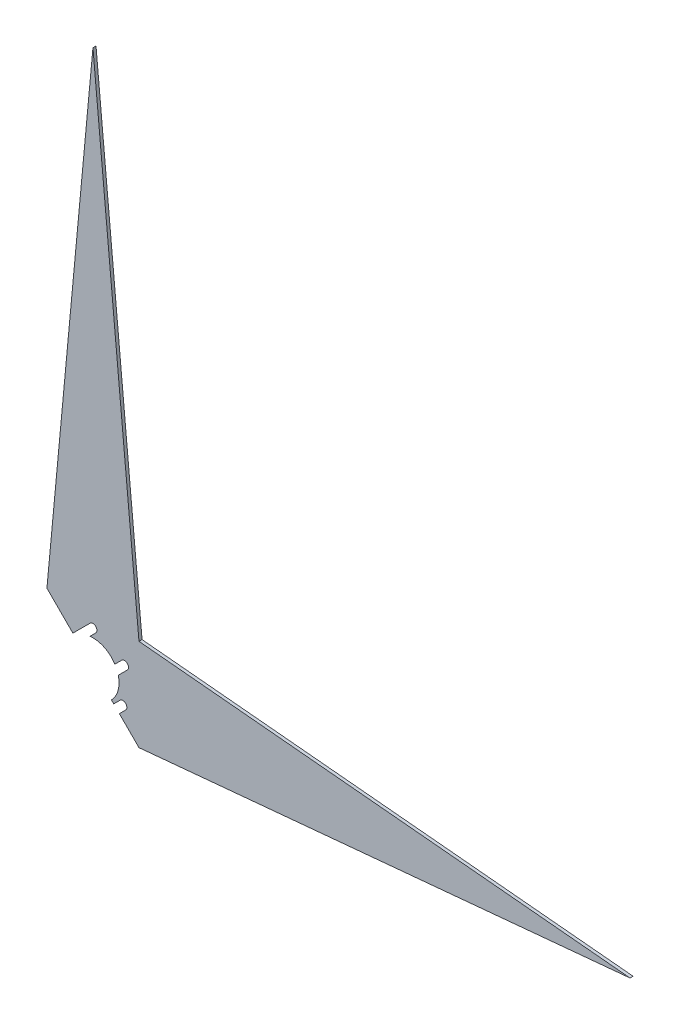
ISO-10303-21;
HEADER;
FILE_DESCRIPTION(('STEP AP214'),'2;1');
FILE_NAME('part.step','',(''),(''),'','','');
FILE_SCHEMA(('AUTOMOTIVE_DESIGN { 1 0 10303 214 1 1 1 1 }'));
ENDSEC;
DATA;
#1=APPLICATION_CONTEXT('core data for automotive mechanical design processes');
#2=APPLICATION_PROTOCOL_DEFINITION('international standard','automotive_design',2000,#1);
#3=PRODUCT_CONTEXT('',#1,'mechanical');
#4=PRODUCT('Part','Part','',(#3));
#5=PRODUCT_RELATED_PRODUCT_CATEGORY('part','',(#4));
#6=PRODUCT_DEFINITION_FORMATION('','',#4);
#7=PRODUCT_DEFINITION_CONTEXT('part definition',#1,'design');
#8=PRODUCT_DEFINITION('design','',#6,#7);
#9=PRODUCT_DEFINITION_SHAPE('','',#8);
#10=(LENGTH_UNIT() NAMED_UNIT(*) SI_UNIT(.MILLI.,.METRE.));
#11=(NAMED_UNIT(*) PLANE_ANGLE_UNIT() SI_UNIT($,.RADIAN.));
#12=(NAMED_UNIT(*) SI_UNIT($,.STERADIAN.) SOLID_ANGLE_UNIT());
#13=UNCERTAINTY_MEASURE_WITH_UNIT(LENGTH_MEASURE(1.E-05),#10,'distance_accuracy_value','');
#14=(GEOMETRIC_REPRESENTATION_CONTEXT(3) GLOBAL_UNCERTAINTY_ASSIGNED_CONTEXT((#13)) GLOBAL_UNIT_ASSIGNED_CONTEXT((#10,
#11,#12)) REPRESENTATION_CONTEXT('',''));
#15=CARTESIAN_POINT('',(0.,0.,0.));
#16=DIRECTION('',(0.,0.,1.));
#17=DIRECTION('',(1.,0.,0.));
#18=AXIS2_PLACEMENT_3D('',#15,#16,#17);
#19=CARTESIAN_POINT('',(23.57,-23.57,2.));
#20=DIRECTION('',(0.,0.,-1.));
#21=DIRECTION('',(-1.,0.,0.));
#22=AXIS2_PLACEMENT_3D('',#19,#20,#21);
#23=CYLINDRICAL_SURFACE('',#22,17.);
#24=DIRECTION('',(0.,0.,-1.));
#25=VECTOR('',#24,1.);
#26=CARTESIAN_POINT('',(21.6366623506154,-6.68029291155493,2.));
#27=LINE('',#26,#25);
#28=CARTESIAN_POINT('',(21.6366623506154,-6.68029291155493,0.));
#29=VERTEX_POINT('',#28);
#30=CARTESIAN_POINT('',(21.6366623506154,-6.68029291155493,2.));
#31=VERTEX_POINT('',#30);
#32=EDGE_CURVE('E278',#29,#31,#27,.F.);
#33=ORIENTED_EDGE('',*,*,#32,.F.);
#34=CARTESIAN_POINT('',(23.57,-23.57,0.));
#35=DIRECTION('',(0.,0.,1.));
#36=DIRECTION('',(1.,0.,0.));
#37=AXIS2_PLACEMENT_3D('',#34,#35,#36);
#38=CIRCLE('',#37,17.);
#39=CARTESIAN_POINT('',(37.8343304419635,-14.3218176357473,0.));
#40=VERTEX_POINT('',#39);
#41=EDGE_CURVE('E245',#40,#29,#38,.T.);
#42=ORIENTED_EDGE('',*,*,#41,.F.);
#43=DIRECTION('',(0.,0.,-1.));
#44=VECTOR('',#43,1.);
#45=CARTESIAN_POINT('',(37.8343304419635,-14.3218176357473,2.));
#46=LINE('',#45,#44);
#47=CARTESIAN_POINT('',(37.8343304419635,-14.3218176357473,2.));
#48=VERTEX_POINT('',#47);
#49=EDGE_CURVE('E269',#48,#40,#46,.T.);
#50=ORIENTED_EDGE('',*,*,#49,.F.);
#51=CARTESIAN_POINT('',(23.57,-23.57,2.));
#52=DIRECTION('',(0.,0.,1.));
#53=DIRECTION('',(1.,0.,0.));
#54=AXIS2_PLACEMENT_3D('',#51,#52,#53);
#55=CIRCLE('',#54,17.);
#56=EDGE_CURVE('E227',#48,#31,#55,.T.);
#57=ORIENTED_EDGE('',*,*,#56,.T.);
#58=EDGE_LOOP('',(#33,#42,#50,#57));
#59=FACE_BOUND('',#58,.T.);
#60=ADVANCED_FACE('F39',(#59),#23,.F.);
#61=CARTESIAN_POINT('',(0.,0.,2.));
#62=DIRECTION('',(0.,0.,1.));
#63=DIRECTION('',(1.,0.,0.));
#64=AXIS2_PLACEMENT_3D('',#61,#62,#63);
#65=PLANE('',#64);
#66=DIRECTION('',(-0.707106781186547,0.707106781186548,0.));
#67=VECTOR('',#66,1.);
#68=CARTESIAN_POINT('',(-6.42999999999999,6.43,2.));
#69=LINE('',#68,#67);
#70=CARTESIAN_POINT('',(10.4815223689151,-10.4815223689151,2.));
#71=VERTEX_POINT('',#70);
#72=CARTESIAN_POINT('',(-6.42999999999999,6.43,2.));
#73=VERTEX_POINT('',#72);
#74=EDGE_CURVE('E170',#71,#73,#69,.T.);
#75=ORIENTED_EDGE('',*,*,#74,.F.);
#76=DIRECTION('',(-0.707106781186548,-0.707106781186547,0.));
#77=VECTOR('',#76,1.);
#78=CARTESIAN_POINT('',(21.7315223689152,0.768477631085008,2.));
#79=LINE('',#78,#77);
#80=CARTESIAN_POINT('',(21.7315223689152,0.768477631085008,2.));
#81=VERTEX_POINT('',#80);
#82=EDGE_CURVE('E187',#81,#71,#79,.T.);
#83=ORIENTED_EDGE('',*,*,#82,.F.);
#84=CARTESIAN_POINT('',(23.5700000000003,-1.07000000000002,2.));
#85=DIRECTION('',(0.,0.,1.));
#86=DIRECTION('',(1.,0.,0.));
#87=AXIS2_PLACEMENT_3D('',#84,#85,#86);
#88=CIRCLE('',#87,2.6);
#89=CARTESIAN_POINT('',(25.4084776310853,-2.90847763108504,2.));
#90=VERTEX_POINT('',#89);
#91=EDGE_CURVE('E262',#90,#81,#88,.T.);
#92=ORIENTED_EDGE('',*,*,#91,.F.);
#93=DIRECTION('',(0.707106781186547,0.707106781186548,0.));
#94=VECTOR('',#93,1.);
#95=CARTESIAN_POINT('',(25.4084776310853,-2.90847763108504,2.));
#96=LINE('',#95,#94);
#97=EDGE_CURVE('E313',#31,#90,#96,.T.);
#98=ORIENTED_EDGE('',*,*,#97,.F.);
#99=ORIENTED_EDGE('',*,*,#56,.F.);
#100=DIRECTION('',(-0.707106781186547,-0.707106781186548,0.));
#101=VECTOR('',#100,1.);
#102=CARTESIAN_POINT('',(42.2996257087955,-9.85652236891518,2.));
#103=LINE('',#102,#101);
#104=CARTESIAN_POINT('',(42.2996257087955,-9.85652236891518,2.));
#105=VERTEX_POINT('',#104);
#106=EDGE_CURVE('E316',#105,#48,#103,.T.);
#107=ORIENTED_EDGE('',*,*,#106,.F.);
#108=CARTESIAN_POINT('',(44.1381033398806,-11.6950000000002,2.));
#109=DIRECTION('',(0.,0.,1.));
#110=DIRECTION('',(1.,0.,0.));
#111=AXIS2_PLACEMENT_3D('',#108,#109,#110);
#112=CIRCLE('',#111,2.6);
#113=CARTESIAN_POINT('',(45.9765809709656,-13.5334776310852,2.));
#114=VERTEX_POINT('',#113);
#115=EDGE_CURVE('E246',#114,#105,#112,.T.);
#116=ORIENTED_EDGE('',*,*,#115,.F.);
#117=DIRECTION('',(0.707106781186547,0.707106781186548,0.));
#118=VECTOR('',#117,1.);
#119=CARTESIAN_POINT('',(45.9765809709656,-13.5334776310852,2.));
#120=LINE('',#119,#118);
#121=CARTESIAN_POINT('',(40.0625708384366,-19.4474877636142,2.));
#122=VERTEX_POINT('',#121);
#123=EDGE_CURVE('E63',#122,#114,#120,.T.);
#124=ORIENTED_EDGE('',*,*,#123,.F.);
#125=CARTESIAN_POINT('',(35.5908152801713,-35.5908152801713,2.));
#126=VERTEX_POINT('',#125);
#127=EDGE_CURVE('E230',#126,#122,#55,.T.);
#128=ORIENTED_EDGE('',*,*,#127,.F.);
#129=DIRECTION('',(-0.707106781186547,0.707106781186548,0.));
#130=VECTOR('',#129,1.);
#131=CARTESIAN_POINT('',(29.7550293010254,-29.7550293010254,2.));
#132=LINE('',#131,#130);
#133=CARTESIAN_POINT('',(37.0993081614899,-37.0993081614899,2.));
#134=VERTEX_POINT('',#133);
#135=EDGE_CURVE('E321',#134,#126,#132,.T.);
#136=ORIENTED_EDGE('',*,*,#135,.F.);
#137=DIRECTION('',(-0.707106781186546,-0.707106781186549,0.));
#138=VECTOR('',#137,1.);
#139=CARTESIAN_POINT('',(41.2170939540648,-32.981522368915,2.));
#140=LINE('',#139,#138);
#141=CARTESIAN_POINT('',(41.2170939540648,-32.981522368915,2.));
#142=VERTEX_POINT('',#141);
#143=EDGE_CURVE('E324',#142,#134,#140,.T.);
#144=ORIENTED_EDGE('',*,*,#143,.F.);
#145=CARTESIAN_POINT('',(43.0555715851499,-34.82,2.));
#146=DIRECTION('',(0.,0.,1.));
#147=DIRECTION('',(1.,0.,0.));
#148=AXIS2_PLACEMENT_3D('',#145,#146,#147);
#149=CIRCLE('',#148,2.60000000000002);
#150=CARTESIAN_POINT('',(44.8940492162349,-36.6584776310851,2.));
#151=VERTEX_POINT('',#150);
#152=EDGE_CURVE('E254',#151,#142,#149,.T.);
#153=ORIENTED_EDGE('',*,*,#152,.F.);
#154=DIRECTION('',(0.707106781186547,0.707106781186547,0.));
#155=VECTOR('',#154,1.);
#156=CARTESIAN_POINT('',(44.8940492162349,-36.658477631085,2.));
#157=LINE('',#156,#155);
#158=CARTESIAN_POINT('',(40.77626342366,-40.77626342366,2.));
#159=VERTEX_POINT('',#158);
#160=EDGE_CURVE('E328',#159,#151,#157,.T.);
#161=ORIENTED_EDGE('',*,*,#160,.F.);
#162=DIRECTION('',(-0.707106781186548,0.707106781186547,0.));
#163=VECTOR('',#162,1.);
#164=CARTESIAN_POINT('',(40.77626342366,-40.77626342366,2.));
#165=LINE('',#164,#163);
#166=CARTESIAN_POINT('',(53.57,-53.57,2.));
#167=VERTEX_POINT('',#166);
#168=EDGE_CURVE('E331',#167,#159,#165,.T.);
#169=ORIENTED_EDGE('',*,*,#168,.F.);
#170=DIRECTION('',(0.995634226059288,0.0933407086930583,0.));
#171=VECTOR('',#170,1.);
#172=CARTESIAN_POINT('',(53.57,-53.57,2.));
#173=LINE('',#172,#171);
#174=CARTESIAN_POINT('',(373.57,-23.57,2.));
#175=VERTEX_POINT('',#174);
#176=EDGE_CURVE('E208',#167,#175,#173,.T.);
#177=ORIENTED_EDGE('',*,*,#176,.T.);
#178=DIRECTION('',(-0.995634226059288,0.0933407086930583,0.));
#179=VECTOR('',#178,1.);
#180=CARTESIAN_POINT('',(373.57,-23.57,2.));
#181=LINE('',#180,#179);
#182=CARTESIAN_POINT('',(53.57,6.43,2.));
#183=VERTEX_POINT('',#182);
#184=EDGE_CURVE('E198',#175,#183,#181,.T.);
#185=ORIENTED_EDGE('',*,*,#184,.T.);
#186=DIRECTION('',(-0.0933407086930583,0.995634226059288,0.));
#187=VECTOR('',#186,1.);
#188=CARTESIAN_POINT('',(53.57,6.43,2.));
#189=LINE('',#188,#187);
#190=CARTESIAN_POINT('',(23.57,326.43,2.));
#191=VERTEX_POINT('',#190);
#192=EDGE_CURVE('E219',#183,#191,#189,.T.);
#193=ORIENTED_EDGE('',*,*,#192,.T.);
#194=DIRECTION('',(-0.0933407086930582,-0.995634226059288,0.));
#195=VECTOR('',#194,1.);
#196=CARTESIAN_POINT('',(23.57,326.43,2.));
#197=LINE('',#196,#195);
#198=EDGE_CURVE('E235',#191,#73,#197,.T.);
#199=ORIENTED_EDGE('',*,*,#198,.T.);
#200=EDGE_LOOP('',(#75,#83,#92,#98,#99,#107,#116,#124,#128,#136,#144,#153,#161,#169,#177,#185,
#193,#199));
#201=FACE_BOUND('',#200,.T.);
#202=ADVANCED_FACE('F372',(#201),#65,.T.);
#203=CARTESIAN_POINT('',(0.,0.,0.));
#204=DIRECTION('',(0.,0.,1.));
#205=DIRECTION('',(1.,0.,0.));
#206=AXIS2_PLACEMENT_3D('',#203,#204,#205);
#207=PLANE('',#206);
#208=DIRECTION('',(-0.707106781186548,-0.707106781186547,0.));
#209=VECTOR('',#208,1.);
#210=CARTESIAN_POINT('',(21.7315223689152,0.768477631085008,0.));
#211=LINE('',#210,#209);
#212=CARTESIAN_POINT('',(21.7315223689152,0.768477631085006,0.));
#213=VERTEX_POINT('',#212);
#214=CARTESIAN_POINT('',(10.4815223689151,-10.4815223689151,0.));
#215=VERTEX_POINT('',#214);
#216=EDGE_CURVE('E184',#213,#215,#211,.T.);
#217=ORIENTED_EDGE('',*,*,#216,.T.);
#218=DIRECTION('',(-0.707106781186547,0.707106781186548,0.));
#219=VECTOR('',#218,1.);
#220=CARTESIAN_POINT('',(-6.42999999999999,6.43,0.));
#221=LINE('',#220,#219);
#222=CARTESIAN_POINT('',(-6.42999999999999,6.43,0.));
#223=VERTEX_POINT('',#222);
#224=EDGE_CURVE('E167',#215,#223,#221,.T.);
#225=ORIENTED_EDGE('',*,*,#224,.T.);
#226=DIRECTION('',(-0.0933407086930582,-0.995634226059288,0.));
#227=VECTOR('',#226,1.);
#228=CARTESIAN_POINT('',(23.57,326.43,0.));
#229=LINE('',#228,#227);
#230=CARTESIAN_POINT('',(23.57,326.43,0.));
#231=VERTEX_POINT('',#230);
#232=EDGE_CURVE('E182',#231,#223,#229,.T.);
#233=ORIENTED_EDGE('',*,*,#232,.F.);
#234=DIRECTION('',(-0.0933407086930583,0.995634226059288,0.));
#235=VECTOR('',#234,1.);
#236=CARTESIAN_POINT('',(53.57,6.43,0.));
#237=LINE('',#236,#235);
#238=CARTESIAN_POINT('',(53.57,6.43,0.));
#239=VERTEX_POINT('',#238);
#240=EDGE_CURVE('E194',#239,#231,#237,.T.);
#241=ORIENTED_EDGE('',*,*,#240,.F.);
#242=DIRECTION('',(-0.995634226059288,0.0933407086930583,0.));
#243=VECTOR('',#242,1.);
#244=CARTESIAN_POINT('',(373.57,-23.57,0.));
#245=LINE('',#244,#243);
#246=CARTESIAN_POINT('',(373.57,-23.57,0.));
#247=VERTEX_POINT('',#246);
#248=EDGE_CURVE('E200',#247,#239,#245,.T.);
#249=ORIENTED_EDGE('',*,*,#248,.F.);
#250=DIRECTION('',(0.995634226059288,0.0933407086930583,0.));
#251=VECTOR('',#250,1.);
#252=CARTESIAN_POINT('',(53.57,-53.57,0.));
#253=LINE('',#252,#251);
#254=CARTESIAN_POINT('',(53.57,-53.57,0.));
#255=VERTEX_POINT('',#254);
#256=EDGE_CURVE('E193',#255,#247,#253,.T.);
#257=ORIENTED_EDGE('',*,*,#256,.F.);
#258=DIRECTION('',(-0.707106781186548,0.707106781186547,0.));
#259=VECTOR('',#258,1.);
#260=CARTESIAN_POINT('',(40.77626342366,-40.77626342366,0.));
#261=LINE('',#260,#259);
#262=CARTESIAN_POINT('',(40.77626342366,-40.77626342366,0.));
#263=VERTEX_POINT('',#262);
#264=EDGE_CURVE('E186',#255,#263,#261,.T.);
#265=ORIENTED_EDGE('',*,*,#264,.T.);
#266=DIRECTION('',(0.707106781186547,0.707106781186547,0.));
#267=VECTOR('',#266,1.);
#268=CARTESIAN_POINT('',(44.8940492162349,-36.658477631085,0.));
#269=LINE('',#268,#267);
#270=CARTESIAN_POINT('',(44.8940492162349,-36.658477631085,0.));
#271=VERTEX_POINT('',#270);
#272=EDGE_CURVE('E357',#263,#271,#269,.T.);
#273=ORIENTED_EDGE('',*,*,#272,.T.);
#274=CARTESIAN_POINT('',(43.0555715851499,-34.82,0.));
#275=DIRECTION('',(0.,0.,1.));
#276=DIRECTION('',(1.,0.,0.));
#277=AXIS2_PLACEMENT_3D('',#274,#275,#276);
#278=CIRCLE('',#277,2.60000000000002);
#279=CARTESIAN_POINT('',(41.2170939540648,-32.981522368915,0.));
#280=VERTEX_POINT('',#279);
#281=EDGE_CURVE('E258',#271,#280,#278,.T.);
#282=ORIENTED_EDGE('',*,*,#281,.T.);
#283=DIRECTION('',(-0.707106781186546,-0.707106781186549,0.));
#284=VECTOR('',#283,1.);
#285=CARTESIAN_POINT('',(41.2170939540648,-32.981522368915,0.));
#286=LINE('',#285,#284);
#287=CARTESIAN_POINT('',(37.0993081614899,-37.0993081614899,0.));
#288=VERTEX_POINT('',#287);
#289=EDGE_CURVE('E353',#280,#288,#286,.T.);
#290=ORIENTED_EDGE('',*,*,#289,.T.);
#291=DIRECTION('',(-0.707106781186547,0.707106781186548,0.));
#292=VECTOR('',#291,1.);
#293=CARTESIAN_POINT('',(29.7550293010254,-29.7550293010254,0.));
#294=LINE('',#293,#292);
#295=CARTESIAN_POINT('',(35.5908152801713,-35.5908152801713,0.));
#296=VERTEX_POINT('',#295);
#297=EDGE_CURVE('E349',#288,#296,#294,.T.);
#298=ORIENTED_EDGE('',*,*,#297,.T.);
#299=CARTESIAN_POINT('',(40.0625708384366,-19.4474877636142,0.));
#300=VERTEX_POINT('',#299);
#301=EDGE_CURVE('E242',#296,#300,#38,.T.);
#302=ORIENTED_EDGE('',*,*,#301,.T.);
#303=DIRECTION('',(0.707106781186547,0.707106781186548,0.));
#304=VECTOR('',#303,1.);
#305=CARTESIAN_POINT('',(45.9765809709656,-13.5334776310852,0.));
#306=LINE('',#305,#304);
#307=CARTESIAN_POINT('',(45.9765809709656,-13.5334776310852,0.));
#308=VERTEX_POINT('',#307);
#309=EDGE_CURVE('E345',#300,#308,#306,.T.);
#310=ORIENTED_EDGE('',*,*,#309,.T.);
#311=CARTESIAN_POINT('',(44.1381033398806,-11.6950000000002,0.));
#312=DIRECTION('',(0.,0.,1.));
#313=DIRECTION('',(1.,0.,0.));
#314=AXIS2_PLACEMENT_3D('',#311,#312,#313);
#315=CIRCLE('',#314,2.6);
#316=CARTESIAN_POINT('',(42.2996257087955,-9.85652236891518,0.));
#317=VERTEX_POINT('',#316);
#318=EDGE_CURVE('E250',#308,#317,#315,.T.);
#319=ORIENTED_EDGE('',*,*,#318,.T.);
#320=DIRECTION('',(-0.707106781186547,-0.707106781186548,0.));
#321=VECTOR('',#320,1.);
#322=CARTESIAN_POINT('',(42.2996257087955,-9.85652236891518,0.));
#323=LINE('',#322,#321);
#324=EDGE_CURVE('E55',#317,#40,#323,.T.);
#325=ORIENTED_EDGE('',*,*,#324,.T.);
#326=ORIENTED_EDGE('',*,*,#41,.T.);
#327=DIRECTION('',(0.707106781186547,0.707106781186548,0.));
#328=VECTOR('',#327,1.);
#329=CARTESIAN_POINT('',(25.4084776310853,-2.90847763108504,0.));
#330=LINE('',#329,#328);
#331=CARTESIAN_POINT('',(25.4084776310853,-2.90847763108504,0.));
#332=VERTEX_POINT('',#331);
#333=EDGE_CURVE('E339',#29,#332,#330,.T.);
#334=ORIENTED_EDGE('',*,*,#333,.T.);
#335=CARTESIAN_POINT('',(23.5700000000003,-1.07000000000002,0.));
#336=DIRECTION('',(0.,0.,1.));
#337=DIRECTION('',(1.,0.,0.));
#338=AXIS2_PLACEMENT_3D('',#335,#336,#337);
#339=CIRCLE('',#338,2.6);
#340=EDGE_CURVE('E266',#332,#213,#339,.T.);
#341=ORIENTED_EDGE('',*,*,#340,.T.);
#342=EDGE_LOOP('',(#217,#225,#233,#241,#249,#257,#265,#273,#282,#290,#298,#302,#310,#319,#325,
#326,#334,#341));
#343=FACE_BOUND('',#342,.T.);
#344=ADVANCED_FACE('F181',(#343),#207,.F.);
#345=CARTESIAN_POINT('',(373.57,-23.57,2.));
#346=DIRECTION('',(-0.0933407086930583,-0.995634226059288,0.));
#347=DIRECTION('',(0.995634226059288,-0.0933407086930583,0.));
#348=AXIS2_PLACEMENT_3D('',#345,#346,#347);
#349=PLANE('',#348);
#350=ORIENTED_EDGE('',*,*,#248,.T.);
#351=DIRECTION('',(0.,0.,-1.));
#352=VECTOR('',#351,1.);
#353=CARTESIAN_POINT('',(53.57,6.43,2.));
#354=LINE('',#353,#352);
#355=EDGE_CURVE('E48',#183,#239,#354,.T.);
#356=ORIENTED_EDGE('',*,*,#355,.F.);
#357=ORIENTED_EDGE('',*,*,#184,.F.);
#358=DIRECTION('',(0.,0.,-1.));
#359=VECTOR('',#358,1.);
#360=CARTESIAN_POINT('',(373.57,-23.57,2.));
#361=LINE('',#360,#359);
#362=EDGE_CURVE('E204',#175,#247,#361,.T.);
#363=ORIENTED_EDGE('',*,*,#362,.T.);
#364=EDGE_LOOP('',(#350,#356,#357,#363));
#365=FACE_BOUND('',#364,.T.);
#366=ADVANCED_FACE('F41',(#365),#349,.F.);
#367=CARTESIAN_POINT('',(53.57,6.43,2.));
#368=DIRECTION('',(-0.995634226059288,-0.0933407086930583,0.));
#369=DIRECTION('',(0.0933407086930583,-0.995634226059288,0.));
#370=AXIS2_PLACEMENT_3D('',#367,#368,#369);
#371=PLANE('',#370);
#372=ORIENTED_EDGE('',*,*,#240,.T.);
#373=DIRECTION('',(0.,0.,-1.));
#374=VECTOR('',#373,1.);
#375=CARTESIAN_POINT('',(23.57,326.43,2.));
#376=LINE('',#375,#374);
#377=EDGE_CURVE('E176',#191,#231,#376,.T.);
#378=ORIENTED_EDGE('',*,*,#377,.F.);
#379=ORIENTED_EDGE('',*,*,#192,.F.);
#380=ORIENTED_EDGE('',*,*,#355,.T.);
#381=EDGE_LOOP('',(#372,#378,#379,#380));
#382=FACE_BOUND('',#381,.T.);
#383=ADVANCED_FACE('F218',(#382),#371,.F.);
#384=CARTESIAN_POINT('',(23.57,326.43,2.));
#385=DIRECTION('',(0.995634226059288,-0.0933407086930583,0.));
#386=DIRECTION('',(0.0933407086930582,0.995634226059288,0.));
#387=AXIS2_PLACEMENT_3D('',#384,#385,#386);
#388=PLANE('',#387);
#389=ORIENTED_EDGE('',*,*,#232,.T.);
#390=DIRECTION('',(0.,0.,-1.));
#391=VECTOR('',#390,1.);
#392=CARTESIAN_POINT('',(-6.42999999999999,6.43,2.));
#393=LINE('',#392,#391);
#394=EDGE_CURVE('E164',#73,#223,#393,.T.);
#395=ORIENTED_EDGE('',*,*,#394,.F.);
#396=ORIENTED_EDGE('',*,*,#198,.F.);
#397=ORIENTED_EDGE('',*,*,#377,.T.);
#398=EDGE_LOOP('',(#389,#395,#396,#397));
#399=FACE_BOUND('',#398,.T.);
#400=ADVANCED_FACE('F190',(#399),#388,.F.);
#401=CARTESIAN_POINT('',(53.57,-53.57,2.));
#402=DIRECTION('',(-0.0933407086930583,0.995634226059288,0.));
#403=DIRECTION('',(-0.995634226059288,-0.0933407086930583,0.));
#404=AXIS2_PLACEMENT_3D('',#401,#402,#403);
#405=PLANE('',#404);
#406=ORIENTED_EDGE('',*,*,#256,.T.);
#407=ORIENTED_EDGE('',*,*,#362,.F.);
#408=ORIENTED_EDGE('',*,*,#176,.F.);
#409=DIRECTION('',(0.,0.,-1.));
#410=VECTOR('',#409,1.);
#411=CARTESIAN_POINT('',(53.57,-53.57,2.));
#412=LINE('',#411,#410);
#413=EDGE_CURVE('E177',#167,#255,#412,.T.);
#414=ORIENTED_EDGE('',*,*,#413,.T.);
#415=EDGE_LOOP('',(#406,#407,#408,#414));
#416=FACE_BOUND('',#415,.T.);
#417=ADVANCED_FACE('F370',(#416),#405,.F.);
#418=DIRECTION('',(0.,0.,-1.));
#419=VECTOR('',#418,1.);
#420=CARTESIAN_POINT('',(40.0625708384366,-19.4474877636142,2.));
#421=LINE('',#420,#419);
#422=EDGE_CURVE('E275',#300,#122,#421,.F.);
#423=ORIENTED_EDGE('',*,*,#422,.F.);
#424=ORIENTED_EDGE('',*,*,#301,.F.);
#425=DIRECTION('',(0.,0.,-1.));
#426=VECTOR('',#425,1.);
#427=CARTESIAN_POINT('',(35.5908152801713,-35.5908152801713,2.));
#428=LINE('',#427,#426);
#429=EDGE_CURVE('E11',#126,#296,#428,.T.);
#430=ORIENTED_EDGE('',*,*,#429,.F.);
#431=ORIENTED_EDGE('',*,*,#127,.T.);
#432=EDGE_LOOP('',(#423,#424,#430,#431));
#433=FACE_BOUND('',#432,.T.);
#434=ADVANCED_FACE('F392',(#433),#23,.F.);
#435=CARTESIAN_POINT('',(44.1381033398806,-11.6950000000002,2.));
#436=DIRECTION('',(0.,0.,-1.));
#437=DIRECTION('',(-1.,0.,0.));
#438=AXIS2_PLACEMENT_3D('',#435,#436,#437);
#439=CYLINDRICAL_SURFACE('',#438,2.6);
#440=DIRECTION('',(0.,0.,1.));
#441=VECTOR('',#440,1.);
#442=CARTESIAN_POINT('',(42.2996257087955,-9.85652236891518,0.));
#443=LINE('',#442,#441);
#444=EDGE_CURVE('E298',#317,#105,#443,.T.);
#445=ORIENTED_EDGE('',*,*,#444,.F.);
#446=ORIENTED_EDGE('',*,*,#318,.F.);
#447=DIRECTION('',(0.,0.,1.));
#448=VECTOR('',#447,1.);
#449=CARTESIAN_POINT('',(45.9765809709656,-13.5334776310852,0.));
#450=LINE('',#449,#448);
#451=EDGE_CURVE('E295',#308,#114,#450,.T.);
#452=ORIENTED_EDGE('',*,*,#451,.T.);
#453=ORIENTED_EDGE('',*,*,#115,.T.);
#454=EDGE_LOOP('',(#445,#446,#452,#453));
#455=FACE_BOUND('',#454,.T.);
#456=ADVANCED_FACE('F397',(#455),#439,.F.);
#457=CARTESIAN_POINT('',(43.0555715851499,-34.82,2.));
#458=DIRECTION('',(0.,0.,-1.));
#459=DIRECTION('',(-1.,0.,0.));
#460=AXIS2_PLACEMENT_3D('',#457,#458,#459);
#461=CYLINDRICAL_SURFACE('',#460,2.60000000000002);
#462=DIRECTION('',(0.,0.,1.));
#463=VECTOR('',#462,1.);
#464=CARTESIAN_POINT('',(41.2170939540648,-32.981522368915,0.));
#465=LINE('',#464,#463);
#466=EDGE_CURVE('E289',#280,#142,#465,.T.);
#467=ORIENTED_EDGE('',*,*,#466,.F.);
#468=ORIENTED_EDGE('',*,*,#281,.F.);
#469=DIRECTION('',(0.,0.,1.));
#470=VECTOR('',#469,1.);
#471=CARTESIAN_POINT('',(44.8940492162349,-36.658477631085,0.));
#472=LINE('',#471,#470);
#473=EDGE_CURVE('E285',#271,#151,#472,.T.);
#474=ORIENTED_EDGE('',*,*,#473,.T.);
#475=ORIENTED_EDGE('',*,*,#152,.T.);
#476=EDGE_LOOP('',(#467,#468,#474,#475));
#477=FACE_BOUND('',#476,.T.);
#478=ADVANCED_FACE('F380',(#477),#461,.F.);
#479=CARTESIAN_POINT('',(23.5700000000003,-1.07000000000002,2.));
#480=DIRECTION('',(0.,0.,-1.));
#481=DIRECTION('',(-1.,0.,0.));
#482=AXIS2_PLACEMENT_3D('',#479,#480,#481);
#483=CYLINDRICAL_SURFACE('',#482,2.6);
#484=DIRECTION('',(0.,0.,1.));
#485=VECTOR('',#484,1.);
#486=CARTESIAN_POINT('',(21.7315223689152,0.768477631085008,0.));
#487=LINE('',#486,#485);
#488=EDGE_CURVE('E305',#213,#81,#487,.T.);
#489=ORIENTED_EDGE('',*,*,#488,.F.);
#490=ORIENTED_EDGE('',*,*,#340,.F.);
#491=DIRECTION('',(0.,0.,1.));
#492=VECTOR('',#491,1.);
#493=CARTESIAN_POINT('',(25.4084776310853,-2.90847763108504,0.));
#494=LINE('',#493,#492);
#495=EDGE_CURVE('E301',#332,#90,#494,.T.);
#496=ORIENTED_EDGE('',*,*,#495,.T.);
#497=ORIENTED_EDGE('',*,*,#91,.T.);
#498=EDGE_LOOP('',(#489,#490,#496,#497));
#499=FACE_BOUND('',#498,.T.);
#500=ADVANCED_FACE('F413',(#499),#483,.F.);
#501=CARTESIAN_POINT('',(25.4084776310853,-2.90847763108504,0.));
#502=DIRECTION('',(0.707106781186548,-0.707106781186547,0.));
#503=DIRECTION('',(0.707106781186547,0.707106781186548,0.));
#504=AXIS2_PLACEMENT_3D('',#501,#502,#503);
#505=PLANE('',#504);
#506=ORIENTED_EDGE('',*,*,#32,.T.);
#507=ORIENTED_EDGE('',*,*,#97,.T.);
#508=ORIENTED_EDGE('',*,*,#495,.F.);
#509=ORIENTED_EDGE('',*,*,#333,.F.);
#510=EDGE_LOOP('',(#506,#507,#508,#509));
#511=FACE_BOUND('',#510,.T.);
#512=ADVANCED_FACE('F408',(#511),#505,.F.);
#513=CARTESIAN_POINT('',(21.7315223689152,0.768477631085008,0.));
#514=DIRECTION('',(-0.707106781186547,0.707106781186548,0.));
#515=DIRECTION('',(-0.707106781186548,-0.707106781186547,0.));
#516=AXIS2_PLACEMENT_3D('',#513,#514,#515);
#517=PLANE('',#516);
#518=ORIENTED_EDGE('',*,*,#82,.T.);
#519=DIRECTION('',(0.,0.,1.));
#520=VECTOR('',#519,1.);
#521=CARTESIAN_POINT('',(10.4815223689151,-10.4815223689151,0.));
#522=LINE('',#521,#520);
#523=EDGE_CURVE('E281',#215,#71,#522,.T.);
#524=ORIENTED_EDGE('',*,*,#523,.F.);
#525=ORIENTED_EDGE('',*,*,#216,.F.);
#526=ORIENTED_EDGE('',*,*,#488,.T.);
#527=EDGE_LOOP('',(#518,#524,#525,#526));
#528=FACE_BOUND('',#527,.T.);
#529=ADVANCED_FACE('F416',(#528),#517,.F.);
#530=CARTESIAN_POINT('',(-6.42999999999999,6.43,0.));
#531=DIRECTION('',(0.707106781186548,0.707106781186547,0.));
#532=DIRECTION('',(-0.707106781186547,0.707106781186548,0.));
#533=AXIS2_PLACEMENT_3D('',#530,#531,#532);
#534=PLANE('',#533);
#535=ORIENTED_EDGE('',*,*,#74,.T.);
#536=ORIENTED_EDGE('',*,*,#394,.T.);
#537=ORIENTED_EDGE('',*,*,#224,.F.);
#538=ORIENTED_EDGE('',*,*,#523,.T.);
#539=EDGE_LOOP('',(#535,#536,#537,#538));
#540=FACE_BOUND('',#539,.T.);
#541=ADVANCED_FACE('F166',(#540),#534,.F.);
#542=CARTESIAN_POINT('',(44.8940492162349,-36.658477631085,0.));
#543=DIRECTION('',(0.707106781186547,-0.707106781186547,0.));
#544=DIRECTION('',(0.707106781186548,0.707106781186548,0.));
#545=AXIS2_PLACEMENT_3D('',#542,#543,#544);
#546=PLANE('',#545);
#547=ORIENTED_EDGE('',*,*,#160,.T.);
#548=ORIENTED_EDGE('',*,*,#473,.F.);
#549=ORIENTED_EDGE('',*,*,#272,.F.);
#550=DIRECTION('',(0.,0.,1.));
#551=VECTOR('',#550,1.);
#552=CARTESIAN_POINT('',(40.77626342366,-40.77626342366,0.));
#553=LINE('',#552,#551);
#554=EDGE_CURVE('E282',#263,#159,#553,.T.);
#555=ORIENTED_EDGE('',*,*,#554,.T.);
#556=EDGE_LOOP('',(#547,#548,#549,#555));
#557=FACE_BOUND('',#556,.T.);
#558=ADVANCED_FACE('F377',(#557),#546,.F.);
#559=CARTESIAN_POINT('',(40.77626342366,-40.77626342366,0.));
#560=DIRECTION('',(0.707106781186547,0.707106781186548,0.));
#561=DIRECTION('',(-0.707106781186548,0.707106781186547,0.));
#562=AXIS2_PLACEMENT_3D('',#559,#560,#561);
#563=PLANE('',#562);
#564=ORIENTED_EDGE('',*,*,#168,.T.);
#565=ORIENTED_EDGE('',*,*,#554,.F.);
#566=ORIENTED_EDGE('',*,*,#264,.F.);
#567=ORIENTED_EDGE('',*,*,#413,.F.);
#568=EDGE_LOOP('',(#564,#565,#566,#567));
#569=FACE_BOUND('',#568,.T.);
#570=ADVANCED_FACE('F366',(#569),#563,.F.);
#571=CARTESIAN_POINT('',(41.2170939540648,-32.981522368915,0.));
#572=DIRECTION('',(-0.707106781186549,0.707106781186546,0.));
#573=DIRECTION('',(-0.707106781186546,-0.707106781186549,0.));
#574=AXIS2_PLACEMENT_3D('',#571,#572,#573);
#575=PLANE('',#574);
#576=ORIENTED_EDGE('',*,*,#143,.T.);
#577=DIRECTION('',(0.,0.,1.));
#578=VECTOR('',#577,1.);
#579=CARTESIAN_POINT('',(37.0993081614899,-37.0993081614899,0.));
#580=LINE('',#579,#578);
#581=EDGE_CURVE('E292',#288,#134,#580,.T.);
#582=ORIENTED_EDGE('',*,*,#581,.F.);
#583=ORIENTED_EDGE('',*,*,#289,.F.);
#584=ORIENTED_EDGE('',*,*,#466,.T.);
#585=EDGE_LOOP('',(#576,#582,#583,#584));
#586=FACE_BOUND('',#585,.T.);
#587=ADVANCED_FACE('F384',(#586),#575,.F.);
#588=CARTESIAN_POINT('',(29.7550293010254,-29.7550293010254,0.));
#589=DIRECTION('',(0.707106781186548,0.707106781186547,0.));
#590=DIRECTION('',(-0.707106781186547,0.707106781186548,0.));
#591=AXIS2_PLACEMENT_3D('',#588,#589,#590);
#592=PLANE('',#591);
#593=ORIENTED_EDGE('',*,*,#429,.T.);
#594=ORIENTED_EDGE('',*,*,#297,.F.);
#595=ORIENTED_EDGE('',*,*,#581,.T.);
#596=ORIENTED_EDGE('',*,*,#135,.T.);
#597=EDGE_LOOP('',(#593,#594,#595,#596));
#598=FACE_BOUND('',#597,.T.);
#599=ADVANCED_FACE('F387',(#598),#592,.F.);
#600=CARTESIAN_POINT('',(45.9765809709656,-13.5334776310852,0.));
#601=DIRECTION('',(0.707106781186548,-0.707106781186547,0.));
#602=DIRECTION('',(0.707106781186547,0.707106781186548,0.));
#603=AXIS2_PLACEMENT_3D('',#600,#601,#602);
#604=PLANE('',#603);
#605=ORIENTED_EDGE('',*,*,#422,.T.);
#606=ORIENTED_EDGE('',*,*,#123,.T.);
#607=ORIENTED_EDGE('',*,*,#451,.F.);
#608=ORIENTED_EDGE('',*,*,#309,.F.);
#609=EDGE_LOOP('',(#605,#606,#607,#608));
#610=FACE_BOUND('',#609,.T.);
#611=ADVANCED_FACE('F399',(#610),#604,.F.);
#612=CARTESIAN_POINT('',(42.2996257087955,-9.85652236891518,0.));
#613=DIRECTION('',(-0.707106781186548,0.707106781186547,0.));
#614=DIRECTION('',(-0.707106781186547,-0.707106781186548,0.));
#615=AXIS2_PLACEMENT_3D('',#612,#613,#614);
#616=PLANE('',#615);
#617=ORIENTED_EDGE('',*,*,#49,.T.);
#618=ORIENTED_EDGE('',*,*,#324,.F.);
#619=ORIENTED_EDGE('',*,*,#444,.T.);
#620=ORIENTED_EDGE('',*,*,#106,.T.);
#621=EDGE_LOOP('',(#617,#618,#619,#620));
#622=FACE_BOUND('',#621,.T.);
#623=ADVANCED_FACE('F560',(#622),#616,.F.);
#624=CLOSED_SHELL('',(#60,#202,#344,#366,#383,#400,#417,#434,#456,#478,#500,#512,#529,#541,#558,
#570,#587,#599,#611,#623));
#625=MANIFOLD_SOLID_BREP('B2',#624);
#626=ADVANCED_BREP_SHAPE_REPRESENTATION('',(#18,#625),#14);
#627=SHAPE_DEFINITION_REPRESENTATION(#9,#626);
ENDSEC;
END-ISO-10303-21;
